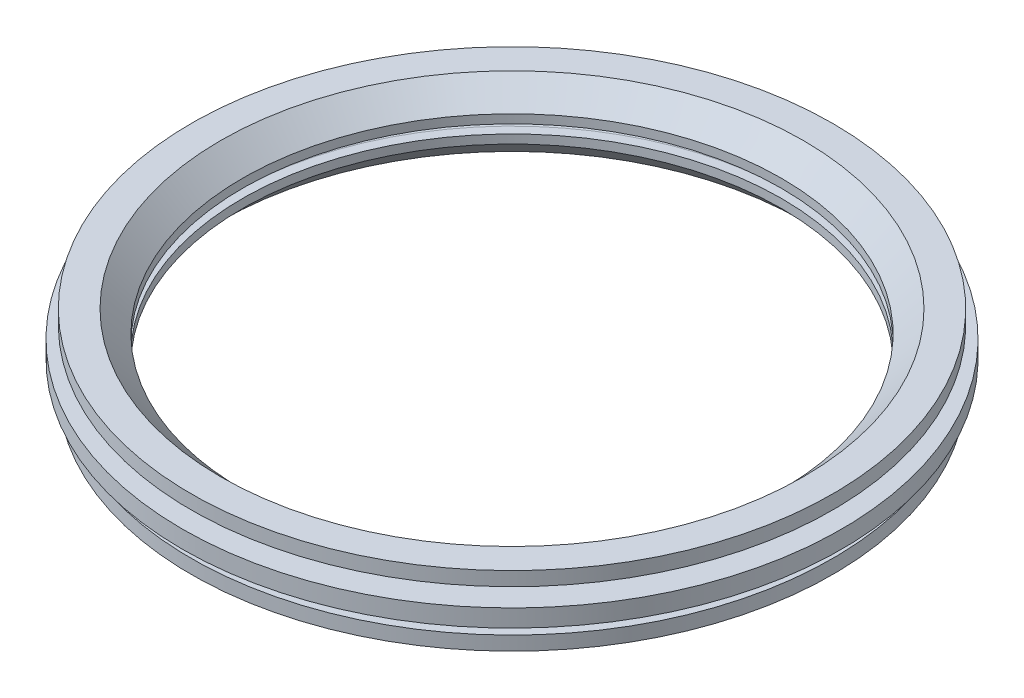
ISO-10303-21;
HEADER;
FILE_DESCRIPTION(('STEP AP214'),'2;1');
FILE_NAME('part.step','',(''),(''),'','','');
FILE_SCHEMA(('AUTOMOTIVE_DESIGN { 1 0 10303 214 1 1 1 1 }'));
ENDSEC;
DATA;
#1=APPLICATION_CONTEXT('core data for automotive mechanical design processes');
#2=APPLICATION_PROTOCOL_DEFINITION('international standard','automotive_design',2000,#1);
#3=PRODUCT_CONTEXT('',#1,'mechanical');
#4=PRODUCT('Part','Part','',(#3));
#5=PRODUCT_RELATED_PRODUCT_CATEGORY('part','',(#4));
#6=PRODUCT_DEFINITION_FORMATION('','',#4);
#7=PRODUCT_DEFINITION_CONTEXT('part definition',#1,'design');
#8=PRODUCT_DEFINITION('design','',#6,#7);
#9=PRODUCT_DEFINITION_SHAPE('','',#8);
#10=(LENGTH_UNIT() NAMED_UNIT(*) SI_UNIT(.MILLI.,.METRE.));
#11=(NAMED_UNIT(*) PLANE_ANGLE_UNIT() SI_UNIT($,.RADIAN.));
#12=(NAMED_UNIT(*) SI_UNIT($,.STERADIAN.) SOLID_ANGLE_UNIT());
#13=UNCERTAINTY_MEASURE_WITH_UNIT(LENGTH_MEASURE(1.E-05),#10,'distance_accuracy_value','');
#14=(GEOMETRIC_REPRESENTATION_CONTEXT(3) GLOBAL_UNCERTAINTY_ASSIGNED_CONTEXT((#13)) GLOBAL_UNIT_ASSIGNED_CONTEXT((#10,
#11,#12)) REPRESENTATION_CONTEXT('',''));
#15=CARTESIAN_POINT('',(0.,0.,0.));
#16=DIRECTION('',(0.,0.,1.));
#17=DIRECTION('',(1.,0.,0.));
#18=AXIS2_PLACEMENT_3D('',#15,#16,#17);
#19=CARTESIAN_POINT('',(49.022,0.793749999999989,0.));
#20=DIRECTION('',(0.,-1.,0.));
#21=DIRECTION('',(0.,0.,-1.));
#22=AXIS2_PLACEMENT_3D('',#19,#20,#21);
#23=PLANE('',#22);
#24=CARTESIAN_POINT('',(0.,0.793749999999977,0.));
#25=DIRECTION('',(0.,-1.,0.));
#26=DIRECTION('',(0.,0.,-1.));
#27=AXIS2_PLACEMENT_3D('',#24,#25,#26);
#28=CIRCLE('',#27,50.76825);
#29=CARTESIAN_POINT('',(0.,0.793749999999977,-50.76825));
#30=VERTEX_POINT('',#29);
#31=EDGE_CURVE('E10',#30,#30,#28,.T.);
#32=ORIENTED_EDGE('',*,*,#31,.T.);
#33=EDGE_LOOP('',(#32));
#34=FACE_BOUND('',#33,.T.);
#35=CARTESIAN_POINT('',(0.,0.79375,0.));
#36=DIRECTION('',(0.,-1.,0.));
#37=DIRECTION('',(0.,0.,-1.));
#38=AXIS2_PLACEMENT_3D('',#35,#36,#37);
#39=CIRCLE('',#38,49.022);
#40=CARTESIAN_POINT('',(0.,0.79375,-49.022));
#41=VERTEX_POINT('',#40);
#42=EDGE_CURVE('E63',#41,#41,#39,.T.);
#43=ORIENTED_EDGE('',*,*,#42,.F.);
#44=EDGE_LOOP('',(#43));
#45=FACE_BOUND('',#44,.T.);
#46=ADVANCED_FACE('F32',(#34,#45),#23,.T.);
#47=CARTESIAN_POINT('',(0.,0.,0.));
#48=DIRECTION('',(0.,-1.,0.));
#49=DIRECTION('',(0.,0.,-1.));
#50=AXIS2_PLACEMENT_3D('',#47,#48,#49);
#51=TOROIDAL_SURFACE('',#50,50.76825,0.793749999999977);
#52=ORIENTED_EDGE('',*,*,#31,.F.);
#53=EDGE_LOOP('',(#52));
#54=FACE_BOUND('',#53,.T.);
#55=CARTESIAN_POINT('',(0.,-0.793749999999977,0.));
#56=DIRECTION('',(0.,-1.,0.));
#57=DIRECTION('',(0.,0.,-1.));
#58=AXIS2_PLACEMENT_3D('',#55,#56,#57);
#59=CIRCLE('',#58,50.76825);
#60=CARTESIAN_POINT('',(0.,-0.793749999999977,-50.76825));
#61=VERTEX_POINT('',#60);
#62=EDGE_CURVE('E66',#61,#61,#59,.T.);
#63=ORIENTED_EDGE('',*,*,#62,.T.);
#64=EDGE_LOOP('',(#63));
#65=FACE_BOUND('',#64,.T.);
#66=ADVANCED_FACE('F141',(#54,#65),#51,.F.);
#67=CARTESIAN_POINT('',(0.,0.,0.));
#68=DIRECTION('',(0.,-1.,0.));
#69=DIRECTION('',(0.,0.,-1.));
#70=AXIS2_PLACEMENT_3D('',#67,#68,#69);
#71=CYLINDRICAL_SURFACE('',#70,59.944);
#72=CARTESIAN_POINT('',(0.,1.5875,0.));
#73=DIRECTION('',(0.,-1.,0.));
#74=DIRECTION('',(0.,0.,-1.));
#75=AXIS2_PLACEMENT_3D('',#72,#73,#74);
#76=CIRCLE('',#75,59.944);
#77=CARTESIAN_POINT('',(0.,1.5875,-59.944));
#78=VERTEX_POINT('',#77);
#79=EDGE_CURVE('E38',#78,#78,#76,.T.);
#80=ORIENTED_EDGE('',*,*,#79,.T.);
#81=EDGE_LOOP('',(#80));
#82=FACE_BOUND('',#81,.T.);
#83=CARTESIAN_POINT('',(0.,-1.5875,0.));
#84=DIRECTION('',(0.,-1.,0.));
#85=DIRECTION('',(0.,0.,-1.));
#86=AXIS2_PLACEMENT_3D('',#83,#84,#85);
#87=CIRCLE('',#86,59.944);
#88=CARTESIAN_POINT('',(0.,-1.5875,-59.944));
#89=VERTEX_POINT('',#88);
#90=EDGE_CURVE('E69',#89,#89,#87,.T.);
#91=ORIENTED_EDGE('',*,*,#90,.F.);
#92=EDGE_LOOP('',(#91));
#93=FACE_BOUND('',#92,.T.);
#94=ADVANCED_FACE('F138',(#82,#93),#71,.T.);
#95=CARTESIAN_POINT('',(53.2765,1.5875,0.));
#96=DIRECTION('',(0.,1.,0.));
#97=DIRECTION('',(0.,0.,1.));
#98=AXIS2_PLACEMENT_3D('',#95,#96,#97);
#99=PLANE('',#98);
#100=CARTESIAN_POINT('',(0.,1.5875,0.));
#101=DIRECTION('',(0.,-1.,0.));
#102=DIRECTION('',(0.,0.,-1.));
#103=AXIS2_PLACEMENT_3D('',#100,#101,#102);
#104=CIRCLE('',#103,53.2765);
#105=CARTESIAN_POINT('',(0.,1.5875,-53.2765));
#106=VERTEX_POINT('',#105);
#107=EDGE_CURVE('E42',#106,#106,#104,.T.);
#108=ORIENTED_EDGE('',*,*,#107,.T.);
#109=EDGE_LOOP('',(#108));
#110=FACE_BOUND('',#109,.T.);
#111=ORIENTED_EDGE('',*,*,#79,.F.);
#112=EDGE_LOOP('',(#111));
#113=FACE_BOUND('',#112,.T.);
#114=ADVANCED_FACE('F140',(#110,#113),#99,.T.);
#115=CARTESIAN_POINT('',(0.,0.,0.));
#116=DIRECTION('',(0.,-1.,0.));
#117=DIRECTION('',(0.,0.,-1.));
#118=AXIS2_PLACEMENT_3D('',#115,#116,#117);
#119=CYLINDRICAL_SURFACE('',#118,53.2765);
#120=CARTESIAN_POINT('',(0.,3.81,0.));
#121=DIRECTION('',(0.,-1.,0.));
#122=DIRECTION('',(0.,0.,-1.));
#123=AXIS2_PLACEMENT_3D('',#120,#121,#122);
#124=CIRCLE('',#123,53.2765);
#125=CARTESIAN_POINT('',(0.,3.81,-53.2765));
#126=VERTEX_POINT('',#125);
#127=EDGE_CURVE('E46',#126,#126,#124,.T.);
#128=ORIENTED_EDGE('',*,*,#127,.T.);
#129=EDGE_LOOP('',(#128));
#130=FACE_BOUND('',#129,.T.);
#131=ORIENTED_EDGE('',*,*,#107,.F.);
#132=EDGE_LOOP('',(#131));
#133=FACE_BOUND('',#132,.T.);
#134=ADVANCED_FACE('F147',(#130,#133),#119,.T.);
#135=CARTESIAN_POINT('',(58.3565,3.81,0.));
#136=DIRECTION('',(0.,-1.,0.));
#137=DIRECTION('',(0.,0.,-1.));
#138=AXIS2_PLACEMENT_3D('',#135,#136,#137);
#139=PLANE('',#138);
#140=CARTESIAN_POINT('',(0.,3.81,0.));
#141=DIRECTION('',(0.,-1.,0.));
#142=DIRECTION('',(0.,0.,-1.));
#143=AXIS2_PLACEMENT_3D('',#140,#141,#142);
#144=CIRCLE('',#143,58.3565);
#145=CARTESIAN_POINT('',(0.,3.81,-58.3565));
#146=VERTEX_POINT('',#145);
#147=EDGE_CURVE('E51',#146,#146,#144,.T.);
#148=ORIENTED_EDGE('',*,*,#147,.T.);
#149=EDGE_LOOP('',(#148));
#150=FACE_BOUND('',#149,.T.);
#151=ORIENTED_EDGE('',*,*,#127,.F.);
#152=EDGE_LOOP('',(#151));
#153=FACE_BOUND('',#152,.T.);
#154=ADVANCED_FACE('F178',(#150,#153),#139,.T.);
#155=CARTESIAN_POINT('',(0.,0.,0.));
#156=DIRECTION('',(0.,-1.,0.));
#157=DIRECTION('',(0.,0.,-1.));
#158=AXIS2_PLACEMENT_3D('',#155,#156,#157);
#159=CYLINDRICAL_SURFACE('',#158,58.3565);
#160=CARTESIAN_POINT('',(0.,6.35,0.));
#161=DIRECTION('',(0.,-1.,0.));
#162=DIRECTION('',(0.,0.,-1.));
#163=AXIS2_PLACEMENT_3D('',#160,#161,#162);
#164=CIRCLE('',#163,58.3565);
#165=CARTESIAN_POINT('',(0.,6.35,-58.3565));
#166=VERTEX_POINT('',#165);
#167=EDGE_CURVE('E54',#166,#166,#164,.T.);
#168=ORIENTED_EDGE('',*,*,#167,.T.);
#169=EDGE_LOOP('',(#168));
#170=FACE_BOUND('',#169,.T.);
#171=ORIENTED_EDGE('',*,*,#147,.F.);
#172=EDGE_LOOP('',(#171));
#173=FACE_BOUND('',#172,.T.);
#174=ADVANCED_FACE('F172',(#170,#173),#159,.T.);
#175=CARTESIAN_POINT('',(52.99075,6.35,0.));
#176=DIRECTION('',(0.,1.,0.));
#177=DIRECTION('',(0.,0.,1.));
#178=AXIS2_PLACEMENT_3D('',#175,#176,#177);
#179=PLANE('',#178);
#180=CARTESIAN_POINT('',(0.,6.35,0.));
#181=DIRECTION('',(0.,-1.,0.));
#182=DIRECTION('',(0.,0.,-1.));
#183=AXIS2_PLACEMENT_3D('',#180,#181,#182);
#184=CIRCLE('',#183,52.99075);
#185=CARTESIAN_POINT('',(0.,6.35,-52.99075));
#186=VERTEX_POINT('',#185);
#187=EDGE_CURVE('E57',#186,#186,#184,.T.);
#188=ORIENTED_EDGE('',*,*,#187,.T.);
#189=EDGE_LOOP('',(#188));
#190=FACE_BOUND('',#189,.T.);
#191=ORIENTED_EDGE('',*,*,#167,.F.);
#192=EDGE_LOOP('',(#191));
#193=FACE_BOUND('',#192,.T.);
#194=ADVANCED_FACE('F166',(#190,#193),#179,.T.);
#195=CARTESIAN_POINT('',(0.,6.35,0.));
#196=DIRECTION('',(0.,1.,0.));
#197=DIRECTION('',(0.,0.,1.));
#198=AXIS2_PLACEMENT_3D('',#195,#196,#197);
#199=CONICAL_SURFACE('',#198,52.99075,0.78539816339745);
#200=CARTESIAN_POINT('',(0.,2.38125,0.));
#201=DIRECTION('',(0.,-1.,0.));
#202=DIRECTION('',(0.,0.,-1.));
#203=AXIS2_PLACEMENT_3D('',#200,#201,#202);
#204=CIRCLE('',#203,49.022);
#205=CARTESIAN_POINT('',(0.,2.38125,-49.022));
#206=VERTEX_POINT('',#205);
#207=EDGE_CURVE('E60',#206,#206,#204,.T.);
#208=ORIENTED_EDGE('',*,*,#207,.T.);
#209=EDGE_LOOP('',(#208));
#210=FACE_BOUND('',#209,.T.);
#211=ORIENTED_EDGE('',*,*,#187,.F.);
#212=EDGE_LOOP('',(#211));
#213=FACE_BOUND('',#212,.T.);
#214=ADVANCED_FACE('F160',(#210,#213),#199,.F.);
#215=CARTESIAN_POINT('',(0.,0.,0.));
#216=DIRECTION('',(0.,-1.,0.));
#217=DIRECTION('',(0.,0.,-1.));
#218=AXIS2_PLACEMENT_3D('',#215,#216,#217);
#219=CYLINDRICAL_SURFACE('',#218,49.022);
#220=ORIENTED_EDGE('',*,*,#42,.T.);
#221=EDGE_LOOP('',(#220));
#222=FACE_BOUND('',#221,.T.);
#223=ORIENTED_EDGE('',*,*,#207,.F.);
#224=EDGE_LOOP('',(#223));
#225=FACE_BOUND('',#224,.T.);
#226=ADVANCED_FACE('F157',(#222,#225),#219,.F.);
#227=CARTESIAN_POINT('',(49.022,-0.793749999999989,0.));
#228=DIRECTION('',(0.,1.,0.));
#229=DIRECTION('',(0.,0.,-1.));
#230=AXIS2_PLACEMENT_3D('',#227,#228,#229);
#231=PLANE('',#230);
#232=ORIENTED_EDGE('',*,*,#62,.F.);
#233=EDGE_LOOP('',(#232));
#234=FACE_BOUND('',#233,.T.);
#235=CARTESIAN_POINT('',(0.,-0.79375,0.));
#236=DIRECTION('',(0.,-1.,0.));
#237=DIRECTION('',(0.,0.,-1.));
#238=AXIS2_PLACEMENT_3D('',#235,#236,#237);
#239=CIRCLE('',#238,49.022);
#240=CARTESIAN_POINT('',(0.,-0.79375,-49.022));
#241=VERTEX_POINT('',#240);
#242=EDGE_CURVE('E90',#241,#241,#239,.T.);
#243=ORIENTED_EDGE('',*,*,#242,.T.);
#244=EDGE_LOOP('',(#243));
#245=FACE_BOUND('',#244,.T.);
#246=ADVANCED_FACE('F94',(#234,#245),#231,.T.);
#247=CARTESIAN_POINT('',(53.2765,-1.5875,0.));
#248=DIRECTION('',(0.,-1.,0.));
#249=DIRECTION('',(0.,0.,1.));
#250=AXIS2_PLACEMENT_3D('',#247,#248,#249);
#251=PLANE('',#250);
#252=CARTESIAN_POINT('',(0.,-1.5875,0.));
#253=DIRECTION('',(0.,-1.,0.));
#254=DIRECTION('',(0.,0.,-1.));
#255=AXIS2_PLACEMENT_3D('',#252,#253,#254);
#256=CIRCLE('',#255,53.2765);
#257=CARTESIAN_POINT('',(0.,-1.5875,-53.2765));
#258=VERTEX_POINT('',#257);
#259=EDGE_CURVE('E72',#258,#258,#256,.T.);
#260=ORIENTED_EDGE('',*,*,#259,.F.);
#261=EDGE_LOOP('',(#260));
#262=FACE_BOUND('',#261,.T.);
#263=ORIENTED_EDGE('',*,*,#90,.T.);
#264=EDGE_LOOP('',(#263));
#265=FACE_BOUND('',#264,.T.);
#266=ADVANCED_FACE('F129',(#262,#265),#251,.T.);
#267=CARTESIAN_POINT('',(0.,0.,0.));
#268=DIRECTION('',(0.,1.,0.));
#269=DIRECTION('',(0.,0.,-1.));
#270=AXIS2_PLACEMENT_3D('',#267,#268,#269);
#271=CYLINDRICAL_SURFACE('',#270,53.2765);
#272=CARTESIAN_POINT('',(0.,-3.81,0.));
#273=DIRECTION('',(0.,-1.,0.));
#274=DIRECTION('',(0.,0.,-1.));
#275=AXIS2_PLACEMENT_3D('',#272,#273,#274);
#276=CIRCLE('',#275,53.2765);
#277=CARTESIAN_POINT('',(0.,-3.81,-53.2765));
#278=VERTEX_POINT('',#277);
#279=EDGE_CURVE('E75',#278,#278,#276,.T.);
#280=ORIENTED_EDGE('',*,*,#279,.F.);
#281=EDGE_LOOP('',(#280));
#282=FACE_BOUND('',#281,.T.);
#283=ORIENTED_EDGE('',*,*,#259,.T.);
#284=EDGE_LOOP('',(#283));
#285=FACE_BOUND('',#284,.T.);
#286=ADVANCED_FACE('F123',(#282,#285),#271,.T.);
#287=CARTESIAN_POINT('',(58.3565,-3.81,0.));
#288=DIRECTION('',(0.,1.,0.));
#289=DIRECTION('',(0.,0.,-1.));
#290=AXIS2_PLACEMENT_3D('',#287,#288,#289);
#291=PLANE('',#290);
#292=CARTESIAN_POINT('',(0.,-3.81,0.));
#293=DIRECTION('',(0.,-1.,0.));
#294=DIRECTION('',(0.,0.,-1.));
#295=AXIS2_PLACEMENT_3D('',#292,#293,#294);
#296=CIRCLE('',#295,58.3565);
#297=CARTESIAN_POINT('',(0.,-3.81,-58.3565));
#298=VERTEX_POINT('',#297);
#299=EDGE_CURVE('E78',#298,#298,#296,.T.);
#300=ORIENTED_EDGE('',*,*,#299,.F.);
#301=EDGE_LOOP('',(#300));
#302=FACE_BOUND('',#301,.T.);
#303=ORIENTED_EDGE('',*,*,#279,.T.);
#304=EDGE_LOOP('',(#303));
#305=FACE_BOUND('',#304,.T.);
#306=ADVANCED_FACE('F117',(#302,#305),#291,.T.);
#307=CARTESIAN_POINT('',(0.,0.,0.));
#308=DIRECTION('',(0.,1.,0.));
#309=DIRECTION('',(0.,0.,-1.));
#310=AXIS2_PLACEMENT_3D('',#307,#308,#309);
#311=CYLINDRICAL_SURFACE('',#310,58.3565);
#312=CARTESIAN_POINT('',(0.,-6.35,0.));
#313=DIRECTION('',(0.,-1.,0.));
#314=DIRECTION('',(0.,0.,-1.));
#315=AXIS2_PLACEMENT_3D('',#312,#313,#314);
#316=CIRCLE('',#315,58.3565);
#317=CARTESIAN_POINT('',(0.,-6.35,-58.3565));
#318=VERTEX_POINT('',#317);
#319=EDGE_CURVE('E81',#318,#318,#316,.T.);
#320=ORIENTED_EDGE('',*,*,#319,.F.);
#321=EDGE_LOOP('',(#320));
#322=FACE_BOUND('',#321,.T.);
#323=ORIENTED_EDGE('',*,*,#299,.T.);
#324=EDGE_LOOP('',(#323));
#325=FACE_BOUND('',#324,.T.);
#326=ADVANCED_FACE('F111',(#322,#325),#311,.T.);
#327=CARTESIAN_POINT('',(52.99075,-6.35,0.));
#328=DIRECTION('',(0.,-1.,0.));
#329=DIRECTION('',(0.,0.,1.));
#330=AXIS2_PLACEMENT_3D('',#327,#328,#329);
#331=PLANE('',#330);
#332=CARTESIAN_POINT('',(0.,-6.35,0.));
#333=DIRECTION('',(0.,-1.,0.));
#334=DIRECTION('',(0.,0.,-1.));
#335=AXIS2_PLACEMENT_3D('',#332,#333,#334);
#336=CIRCLE('',#335,52.99075);
#337=CARTESIAN_POINT('',(0.,-6.35,-52.99075));
#338=VERTEX_POINT('',#337);
#339=EDGE_CURVE('E84',#338,#338,#336,.T.);
#340=ORIENTED_EDGE('',*,*,#339,.F.);
#341=EDGE_LOOP('',(#340));
#342=FACE_BOUND('',#341,.T.);
#343=ORIENTED_EDGE('',*,*,#319,.T.);
#344=EDGE_LOOP('',(#343));
#345=FACE_BOUND('',#344,.T.);
#346=ADVANCED_FACE('F105',(#342,#345),#331,.T.);
#347=CARTESIAN_POINT('',(0.,-6.35,0.));
#348=DIRECTION('',(0.,-1.,0.));
#349=DIRECTION('',(0.,0.,1.));
#350=AXIS2_PLACEMENT_3D('',#347,#348,#349);
#351=CONICAL_SURFACE('',#350,52.99075,0.78539816339745);
#352=CARTESIAN_POINT('',(0.,-2.38125,0.));
#353=DIRECTION('',(0.,-1.,0.));
#354=DIRECTION('',(0.,0.,-1.));
#355=AXIS2_PLACEMENT_3D('',#352,#353,#354);
#356=CIRCLE('',#355,49.022);
#357=CARTESIAN_POINT('',(0.,-2.38125,-49.022));
#358=VERTEX_POINT('',#357);
#359=EDGE_CURVE('E87',#358,#358,#356,.T.);
#360=ORIENTED_EDGE('',*,*,#359,.F.);
#361=EDGE_LOOP('',(#360));
#362=FACE_BOUND('',#361,.T.);
#363=ORIENTED_EDGE('',*,*,#339,.T.);
#364=EDGE_LOOP('',(#363));
#365=FACE_BOUND('',#364,.T.);
#366=ADVANCED_FACE('F99',(#362,#365),#351,.F.);
#367=CARTESIAN_POINT('',(0.,0.,0.));
#368=DIRECTION('',(0.,1.,0.));
#369=DIRECTION('',(0.,0.,-1.));
#370=AXIS2_PLACEMENT_3D('',#367,#368,#369);
#371=CYLINDRICAL_SURFACE('',#370,49.022);
#372=ORIENTED_EDGE('',*,*,#242,.F.);
#373=EDGE_LOOP('',(#372));
#374=FACE_BOUND('',#373,.T.);
#375=ORIENTED_EDGE('',*,*,#359,.T.);
#376=EDGE_LOOP('',(#375));
#377=FACE_BOUND('',#376,.T.);
#378=ADVANCED_FACE('F96',(#374,#377),#371,.F.);
#379=CLOSED_SHELL('',(#46,#66,#94,#114,#134,#154,#174,#194,#214,#226,#246,#266,#286,#306,#326,
#346,#366,#378));
#380=MANIFOLD_SOLID_BREP('B2',#379);
#381=ADVANCED_BREP_SHAPE_REPRESENTATION('',(#18,#380),#14);
#382=SHAPE_DEFINITION_REPRESENTATION(#9,#381);
ENDSEC;
END-ISO-10303-21;
